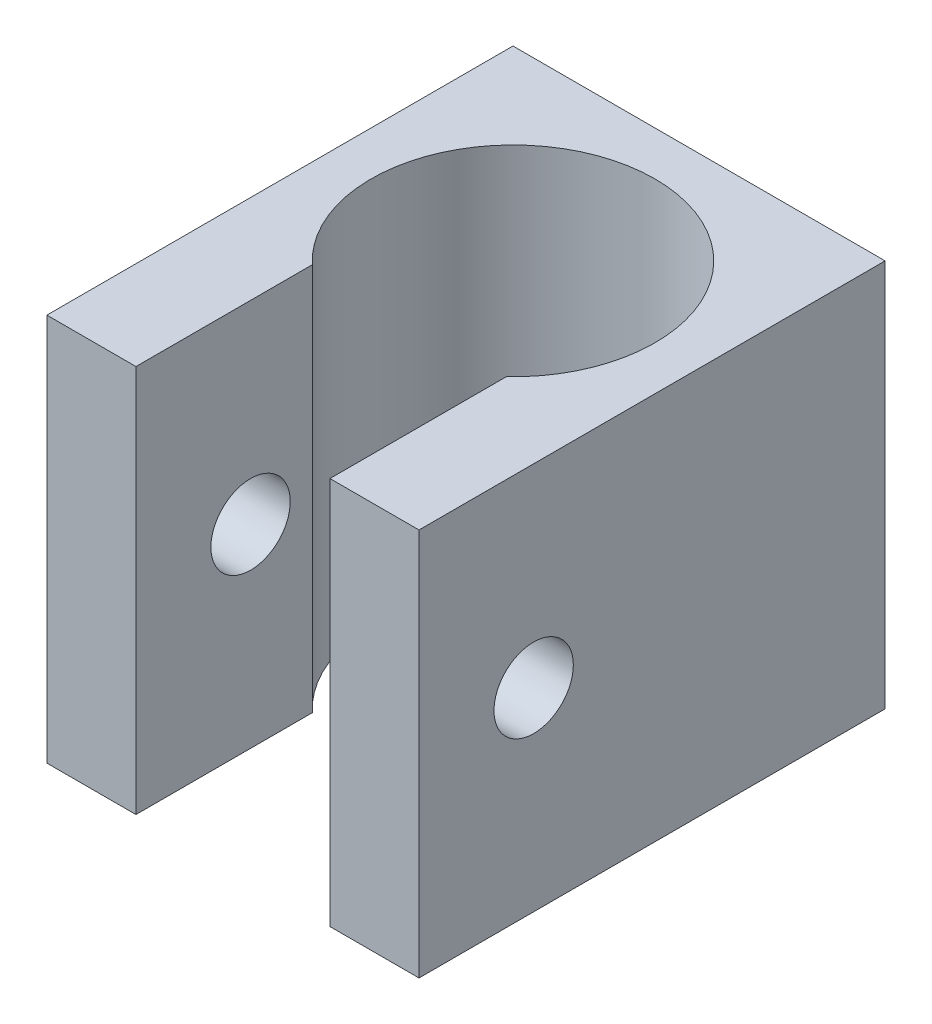
ISO-10303-21;
HEADER;
FILE_DESCRIPTION(('STEP AP214'),'2;1');
FILE_NAME('part.step','',(''),(''),'','','');
FILE_SCHEMA(('AUTOMOTIVE_DESIGN { 1 0 10303 214 1 1 1 1 }'));
ENDSEC;
DATA;
#1=APPLICATION_CONTEXT('core data for automotive mechanical design processes');
#2=APPLICATION_PROTOCOL_DEFINITION('international standard','automotive_design',2000,#1);
#3=PRODUCT_CONTEXT('',#1,'mechanical');
#4=PRODUCT('Part','Part','',(#3));
#5=PRODUCT_RELATED_PRODUCT_CATEGORY('part','',(#4));
#6=PRODUCT_DEFINITION_FORMATION('','',#4);
#7=PRODUCT_DEFINITION_CONTEXT('part definition',#1,'design');
#8=PRODUCT_DEFINITION('design','',#6,#7);
#9=PRODUCT_DEFINITION_SHAPE('','',#8);
#10=(LENGTH_UNIT() NAMED_UNIT(*) SI_UNIT(.MILLI.,.METRE.));
#11=(NAMED_UNIT(*) PLANE_ANGLE_UNIT() SI_UNIT($,.RADIAN.));
#12=(NAMED_UNIT(*) SI_UNIT($,.STERADIAN.) SOLID_ANGLE_UNIT());
#13=UNCERTAINTY_MEASURE_WITH_UNIT(LENGTH_MEASURE(1.E-05),#10,'distance_accuracy_value','');
#14=(GEOMETRIC_REPRESENTATION_CONTEXT(3) GLOBAL_UNCERTAINTY_ASSIGNED_CONTEXT((#13)) GLOBAL_UNIT_ASSIGNED_CONTEXT((#10,
#11,#12)) REPRESENTATION_CONTEXT('',''));
#15=CARTESIAN_POINT('',(0.,0.,0.));
#16=DIRECTION('',(0.,0.,1.));
#17=DIRECTION('',(1.,0.,0.));
#18=AXIS2_PLACEMENT_3D('',#15,#16,#17);
#19=CARTESIAN_POINT('',(-5.49999999999999,11.,15.));
#20=DIRECTION('',(-1.,0.,0.));
#21=DIRECTION('',(0.,0.,1.));
#22=AXIS2_PLACEMENT_3D('',#19,#20,#21);
#23=PLANE('',#22);
#24=CARTESIAN_POINT('',(-5.49999999999999,0.,8.49999999999999));
#25=DIRECTION('',(-1.,0.,0.));
#26=DIRECTION('',(0.,0.,1.));
#27=AXIS2_PLACEMENT_3D('',#24,#25,#26);
#28=CIRCLE('',#27,2.25);
#29=CARTESIAN_POINT('',(-5.49999999999999,0.,10.75));
#30=VERTEX_POINT('',#29);
#31=EDGE_CURVE('E135',#30,#30,#28,.T.);
#32=ORIENTED_EDGE('',*,*,#31,.T.);
#33=EDGE_LOOP('',(#32));
#34=FACE_BOUND('',#33,.T.);
#35=DIRECTION('',(0.,0.,-1.));
#36=VECTOR('',#35,1.);
#37=CARTESIAN_POINT('',(-5.49999999999999,-11.,15.));
#38=LINE('',#37,#36);
#39=CARTESIAN_POINT('',(-5.49999999999999,-11.,15.));
#40=VERTEX_POINT('',#39);
#41=CARTESIAN_POINT('',(-5.49999999999999,-11.,5.));
#42=VERTEX_POINT('',#41);
#43=EDGE_CURVE('E131',#40,#42,#38,.T.);
#44=ORIENTED_EDGE('',*,*,#43,.T.);
#45=DIRECTION('',(0.,-1.,0.));
#46=VECTOR('',#45,1.);
#47=CARTESIAN_POINT('',(-5.49999999999999,11.,5.));
#48=LINE('',#47,#46);
#49=CARTESIAN_POINT('',(-5.49999999999999,11.,5.));
#50=VERTEX_POINT('',#49);
#51=EDGE_CURVE('E11',#50,#42,#48,.T.);
#52=ORIENTED_EDGE('',*,*,#51,.F.);
#53=DIRECTION('',(0.,0.,-1.));
#54=VECTOR('',#53,1.);
#55=CARTESIAN_POINT('',(-5.49999999999999,11.,15.));
#56=LINE('',#55,#54);
#57=CARTESIAN_POINT('',(-5.49999999999999,11.,15.));
#58=VERTEX_POINT('',#57);
#59=EDGE_CURVE('E146',#58,#50,#56,.T.);
#60=ORIENTED_EDGE('',*,*,#59,.F.);
#61=DIRECTION('',(0.,-1.,0.));
#62=VECTOR('',#61,1.);
#63=CARTESIAN_POINT('',(-5.49999999999999,11.,15.));
#64=LINE('',#63,#62);
#65=EDGE_CURVE('E127',#58,#40,#64,.T.);
#66=ORIENTED_EDGE('',*,*,#65,.T.);
#67=EDGE_LOOP('',(#44,#52,#60,#66));
#68=FACE_BOUND('',#67,.T.);
#69=ADVANCED_FACE('F35',(#34,#68),#23,.F.);
#70=CARTESIAN_POINT('',(0.,11.,-0.878137460114387));
#71=DIRECTION('',(0.,-1.,0.));
#72=DIRECTION('',(0.,0.,-1.));
#73=AXIS2_PLACEMENT_3D('',#70,#71,#72);
#74=CYLINDRICAL_SURFACE('',#73,8.05);
#75=CARTESIAN_POINT('',(0.,-11.,-0.878137460114387));
#76=DIRECTION('',(0.,-1.,0.));
#77=DIRECTION('',(0.,0.,-1.));
#78=AXIS2_PLACEMENT_3D('',#75,#76,#77);
#79=CIRCLE('',#78,8.05);
#80=CARTESIAN_POINT('',(5.50000000000001,-11.,5.));
#81=VERTEX_POINT('',#80);
#82=EDGE_CURVE('E134',#42,#81,#79,.T.);
#83=ORIENTED_EDGE('',*,*,#82,.T.);
#84=DIRECTION('',(0.,-1.,0.));
#85=VECTOR('',#84,1.);
#86=CARTESIAN_POINT('',(5.50000000000001,11.,5.));
#87=LINE('',#86,#85);
#88=CARTESIAN_POINT('',(5.50000000000001,11.,5.));
#89=VERTEX_POINT('',#88);
#90=EDGE_CURVE('E43',#89,#81,#87,.T.);
#91=ORIENTED_EDGE('',*,*,#90,.F.);
#92=CARTESIAN_POINT('',(0.,11.,-0.878137460114387));
#93=DIRECTION('',(0.,-1.,0.));
#94=DIRECTION('',(0.,0.,-1.));
#95=AXIS2_PLACEMENT_3D('',#92,#93,#94);
#96=CIRCLE('',#95,8.05);
#97=EDGE_CURVE('E94',#50,#89,#96,.T.);
#98=ORIENTED_EDGE('',*,*,#97,.F.);
#99=ORIENTED_EDGE('',*,*,#51,.T.);
#100=EDGE_LOOP('',(#83,#91,#98,#99));
#101=FACE_BOUND('',#100,.T.);
#102=ADVANCED_FACE('F203',(#101),#74,.F.);
#103=CARTESIAN_POINT('',(5.50000000000001,11.,15.));
#104=DIRECTION('',(1.,0.,0.));
#105=DIRECTION('',(0.,0.,-1.));
#106=AXIS2_PLACEMENT_3D('',#103,#104,#105);
#107=PLANE('',#106);
#108=CARTESIAN_POINT('',(5.50000000000001,0.,8.49999999999999));
#109=DIRECTION('',(1.,0.,0.));
#110=DIRECTION('',(0.,0.,-1.));
#111=AXIS2_PLACEMENT_3D('',#108,#109,#110);
#112=CIRCLE('',#111,2.25);
#113=CARTESIAN_POINT('',(5.50000000000001,0.,6.24999999999999));
#114=VERTEX_POINT('',#113);
#115=EDGE_CURVE('E181',#114,#114,#112,.T.);
#116=ORIENTED_EDGE('',*,*,#115,.T.);
#117=EDGE_LOOP('',(#116));
#118=FACE_BOUND('',#117,.T.);
#119=DIRECTION('',(0.,0.,1.));
#120=VECTOR('',#119,1.);
#121=CARTESIAN_POINT('',(5.50000000000001,-11.,15.));
#122=LINE('',#121,#120);
#123=CARTESIAN_POINT('',(5.50000000000001,-11.,15.));
#124=VERTEX_POINT('',#123);
#125=EDGE_CURVE('E137',#81,#124,#122,.T.);
#126=ORIENTED_EDGE('',*,*,#125,.T.);
#127=DIRECTION('',(0.,-1.,0.));
#128=VECTOR('',#127,1.);
#129=CARTESIAN_POINT('',(5.50000000000001,11.,15.));
#130=LINE('',#129,#128);
#131=CARTESIAN_POINT('',(5.50000000000001,11.,15.));
#132=VERTEX_POINT('',#131);
#133=EDGE_CURVE('E153',#132,#124,#130,.T.);
#134=ORIENTED_EDGE('',*,*,#133,.F.);
#135=DIRECTION('',(0.,0.,1.));
#136=VECTOR('',#135,1.);
#137=CARTESIAN_POINT('',(5.50000000000001,11.,15.));
#138=LINE('',#137,#136);
#139=EDGE_CURVE('E161',#89,#132,#138,.T.);
#140=ORIENTED_EDGE('',*,*,#139,.F.);
#141=ORIENTED_EDGE('',*,*,#90,.T.);
#142=EDGE_LOOP('',(#126,#134,#140,#141));
#143=FACE_BOUND('',#142,.T.);
#144=ADVANCED_FACE('F159',(#118,#143),#107,.F.);
#145=CARTESIAN_POINT('',(10.55,11.,15.));
#146=DIRECTION('',(0.,0.,-1.));
#147=DIRECTION('',(-1.,0.,0.));
#148=AXIS2_PLACEMENT_3D('',#145,#146,#147);
#149=PLANE('',#148);
#150=DIRECTION('',(1.,0.,0.));
#151=VECTOR('',#150,1.);
#152=CARTESIAN_POINT('',(10.55,-11.,15.));
#153=LINE('',#152,#151);
#154=CARTESIAN_POINT('',(10.55,-11.,15.));
#155=VERTEX_POINT('',#154);
#156=EDGE_CURVE('E139',#124,#155,#153,.T.);
#157=ORIENTED_EDGE('',*,*,#156,.T.);
#158=DIRECTION('',(0.,-1.,0.));
#159=VECTOR('',#158,1.);
#160=CARTESIAN_POINT('',(10.55,11.,15.));
#161=LINE('',#160,#159);
#162=CARTESIAN_POINT('',(10.55,11.,15.));
#163=VERTEX_POINT('',#162);
#164=EDGE_CURVE('E150',#163,#155,#161,.T.);
#165=ORIENTED_EDGE('',*,*,#164,.F.);
#166=DIRECTION('',(1.,0.,0.));
#167=VECTOR('',#166,1.);
#168=CARTESIAN_POINT('',(10.55,11.,15.));
#169=LINE('',#168,#167);
#170=EDGE_CURVE('E173',#132,#163,#169,.T.);
#171=ORIENTED_EDGE('',*,*,#170,.F.);
#172=ORIENTED_EDGE('',*,*,#133,.T.);
#173=EDGE_LOOP('',(#157,#165,#171,#172));
#174=FACE_BOUND('',#173,.T.);
#175=ADVANCED_FACE('F169',(#174),#149,.F.);
#176=CARTESIAN_POINT('',(10.55,11.,-11.4281374601144));
#177=DIRECTION('',(-1.,0.,0.));
#178=DIRECTION('',(0.,0.,1.));
#179=AXIS2_PLACEMENT_3D('',#176,#177,#178);
#180=PLANE('',#179);
#181=CARTESIAN_POINT('',(10.55,0.,8.49999999999999));
#182=DIRECTION('',(1.,0.,0.));
#183=DIRECTION('',(0.,0.,-1.));
#184=AXIS2_PLACEMENT_3D('',#181,#182,#183);
#185=CIRCLE('',#184,2.25);
#186=CARTESIAN_POINT('',(10.55,0.,6.24999999999999));
#187=VERTEX_POINT('',#186);
#188=EDGE_CURVE('E187',#187,#187,#185,.T.);
#189=ORIENTED_EDGE('',*,*,#188,.F.);
#190=EDGE_LOOP('',(#189));
#191=FACE_BOUND('',#190,.T.);
#192=DIRECTION('',(0.,0.,-1.));
#193=VECTOR('',#192,1.);
#194=CARTESIAN_POINT('',(10.55,-11.,-11.4281374601144));
#195=LINE('',#194,#193);
#196=CARTESIAN_POINT('',(10.55,-11.,-11.4281374601144));
#197=VERTEX_POINT('',#196);
#198=EDGE_CURVE('E141',#155,#197,#195,.T.);
#199=ORIENTED_EDGE('',*,*,#198,.T.);
#200=DIRECTION('',(0.,-1.,0.));
#201=VECTOR('',#200,1.);
#202=CARTESIAN_POINT('',(10.55,11.,-11.4281374601144));
#203=LINE('',#202,#201);
#204=CARTESIAN_POINT('',(10.55,11.,-11.4281374601144));
#205=VERTEX_POINT('',#204);
#206=EDGE_CURVE('E122',#205,#197,#203,.T.);
#207=ORIENTED_EDGE('',*,*,#206,.F.);
#208=DIRECTION('',(0.,0.,-1.));
#209=VECTOR('',#208,1.);
#210=CARTESIAN_POINT('',(10.55,11.,-11.4281374601144));
#211=LINE('',#210,#209);
#212=EDGE_CURVE('E113',#163,#205,#211,.T.);
#213=ORIENTED_EDGE('',*,*,#212,.F.);
#214=ORIENTED_EDGE('',*,*,#164,.T.);
#215=EDGE_LOOP('',(#199,#207,#213,#214));
#216=FACE_BOUND('',#215,.T.);
#217=ADVANCED_FACE('F172',(#191,#216),#180,.F.);
#218=CARTESIAN_POINT('',(-10.55,11.,-11.4281374601144));
#219=DIRECTION('',(0.,0.,1.));
#220=DIRECTION('',(1.,0.,0.));
#221=AXIS2_PLACEMENT_3D('',#218,#219,#220);
#222=PLANE('',#221);
#223=DIRECTION('',(-1.,0.,0.));
#224=VECTOR('',#223,1.);
#225=CARTESIAN_POINT('',(-10.55,-11.,-11.4281374601144));
#226=LINE('',#225,#224);
#227=CARTESIAN_POINT('',(-10.55,-11.,-11.4281374601144));
#228=VERTEX_POINT('',#227);
#229=EDGE_CURVE('E121',#197,#228,#226,.T.);
#230=ORIENTED_EDGE('',*,*,#229,.T.);
#231=DIRECTION('',(0.,-1.,0.));
#232=VECTOR('',#231,1.);
#233=CARTESIAN_POINT('',(-10.55,11.,-11.4281374601144));
#234=LINE('',#233,#232);
#235=CARTESIAN_POINT('',(-10.55,11.,-11.4281374601144));
#236=VERTEX_POINT('',#235);
#237=EDGE_CURVE('E118',#236,#228,#234,.T.);
#238=ORIENTED_EDGE('',*,*,#237,.F.);
#239=DIRECTION('',(-1.,0.,0.));
#240=VECTOR('',#239,1.);
#241=CARTESIAN_POINT('',(-10.55,11.,-11.4281374601144));
#242=LINE('',#241,#240);
#243=EDGE_CURVE('E107',#205,#236,#242,.T.);
#244=ORIENTED_EDGE('',*,*,#243,.F.);
#245=ORIENTED_EDGE('',*,*,#206,.T.);
#246=EDGE_LOOP('',(#230,#238,#244,#245));
#247=FACE_BOUND('',#246,.T.);
#248=ADVANCED_FACE('F119',(#247),#222,.F.);
#249=CARTESIAN_POINT('',(-10.55,11.,15.));
#250=DIRECTION('',(1.,0.,0.));
#251=DIRECTION('',(0.,0.,-1.));
#252=AXIS2_PLACEMENT_3D('',#249,#250,#251);
#253=PLANE('',#252);
#254=CARTESIAN_POINT('',(-10.55,0.,8.49999999999999));
#255=DIRECTION('',(1.,0.,0.));
#256=DIRECTION('',(0.,0.,-1.));
#257=AXIS2_PLACEMENT_3D('',#254,#255,#256);
#258=CIRCLE('',#257,2.25);
#259=CARTESIAN_POINT('',(-10.55,0.,6.24999999999999));
#260=VERTEX_POINT('',#259);
#261=EDGE_CURVE('E184',#260,#260,#258,.F.);
#262=ORIENTED_EDGE('',*,*,#261,.F.);
#263=EDGE_LOOP('',(#262));
#264=FACE_BOUND('',#263,.T.);
#265=DIRECTION('',(0.,0.,1.));
#266=VECTOR('',#265,1.);
#267=CARTESIAN_POINT('',(-10.55,-11.,15.));
#268=LINE('',#267,#266);
#269=CARTESIAN_POINT('',(-10.55,-11.,15.));
#270=VERTEX_POINT('',#269);
#271=EDGE_CURVE('E80',#228,#270,#268,.T.);
#272=ORIENTED_EDGE('',*,*,#271,.T.);
#273=DIRECTION('',(0.,-1.,0.));
#274=VECTOR('',#273,1.);
#275=CARTESIAN_POINT('',(-10.55,11.,15.));
#276=LINE('',#275,#274);
#277=CARTESIAN_POINT('',(-10.55,11.,15.));
#278=VERTEX_POINT('',#277);
#279=EDGE_CURVE('E123',#278,#270,#276,.T.);
#280=ORIENTED_EDGE('',*,*,#279,.F.);
#281=DIRECTION('',(0.,0.,1.));
#282=VECTOR('',#281,1.);
#283=CARTESIAN_POINT('',(-10.55,11.,15.));
#284=LINE('',#283,#282);
#285=EDGE_CURVE('E111',#236,#278,#284,.T.);
#286=ORIENTED_EDGE('',*,*,#285,.F.);
#287=ORIENTED_EDGE('',*,*,#237,.T.);
#288=EDGE_LOOP('',(#272,#280,#286,#287));
#289=FACE_BOUND('',#288,.T.);
#290=ADVANCED_FACE('F125',(#264,#289),#253,.F.);
#291=CARTESIAN_POINT('',(-5.49999999999999,11.,15.));
#292=DIRECTION('',(0.,0.,-1.));
#293=DIRECTION('',(-1.,0.,0.));
#294=AXIS2_PLACEMENT_3D('',#291,#292,#293);
#295=PLANE('',#294);
#296=DIRECTION('',(1.,0.,0.));
#297=VECTOR('',#296,1.);
#298=CARTESIAN_POINT('',(-5.49999999999999,-11.,15.));
#299=LINE('',#298,#297);
#300=EDGE_CURVE('E86',#270,#40,#299,.T.);
#301=ORIENTED_EDGE('',*,*,#300,.T.);
#302=ORIENTED_EDGE('',*,*,#65,.F.);
#303=DIRECTION('',(1.,0.,0.));
#304=VECTOR('',#303,1.);
#305=CARTESIAN_POINT('',(-5.49999999999999,11.,15.));
#306=LINE('',#305,#304);
#307=EDGE_CURVE('E51',#278,#58,#306,.T.);
#308=ORIENTED_EDGE('',*,*,#307,.F.);
#309=ORIENTED_EDGE('',*,*,#279,.T.);
#310=EDGE_LOOP('',(#301,#302,#308,#309));
#311=FACE_BOUND('',#310,.T.);
#312=ADVANCED_FACE('F212',(#311),#295,.F.);
#313=CARTESIAN_POINT('',(0.,11.,-0.878137460114387));
#314=DIRECTION('',(0.,-1.,0.));
#315=DIRECTION('',(0.,0.,-1.));
#316=AXIS2_PLACEMENT_3D('',#313,#314,#315);
#317=PLANE('',#316);
#318=ORIENTED_EDGE('',*,*,#59,.T.);
#319=ORIENTED_EDGE('',*,*,#97,.T.);
#320=ORIENTED_EDGE('',*,*,#139,.T.);
#321=ORIENTED_EDGE('',*,*,#170,.T.);
#322=ORIENTED_EDGE('',*,*,#212,.T.);
#323=ORIENTED_EDGE('',*,*,#243,.T.);
#324=ORIENTED_EDGE('',*,*,#285,.T.);
#325=ORIENTED_EDGE('',*,*,#307,.T.);
#326=EDGE_LOOP('',(#318,#319,#320,#321,#322,#323,#324,#325));
#327=FACE_BOUND('',#326,.T.);
#328=ADVANCED_FACE('F109',(#327),#317,.F.);
#329=CARTESIAN_POINT('',(0.,-11.,-0.878137460114387));
#330=DIRECTION('',(0.,-1.,0.));
#331=DIRECTION('',(0.,0.,-1.));
#332=AXIS2_PLACEMENT_3D('',#329,#330,#331);
#333=PLANE('',#332);
#334=ORIENTED_EDGE('',*,*,#43,.F.);
#335=ORIENTED_EDGE('',*,*,#300,.F.);
#336=ORIENTED_EDGE('',*,*,#271,.F.);
#337=ORIENTED_EDGE('',*,*,#229,.F.);
#338=ORIENTED_EDGE('',*,*,#198,.F.);
#339=ORIENTED_EDGE('',*,*,#156,.F.);
#340=ORIENTED_EDGE('',*,*,#125,.F.);
#341=ORIENTED_EDGE('',*,*,#82,.F.);
#342=EDGE_LOOP('',(#334,#335,#336,#337,#338,#339,#340,#341));
#343=FACE_BOUND('',#342,.T.);
#344=ADVANCED_FACE('F165',(#343),#333,.T.);
#345=CARTESIAN_POINT('',(-16.9139610306789,0.,8.49999999999999));
#346=DIRECTION('',(1.,0.,0.));
#347=DIRECTION('',(0.,0.,-1.));
#348=AXIS2_PLACEMENT_3D('',#345,#346,#347);
#349=CYLINDRICAL_SURFACE('',#348,2.25);
#350=ORIENTED_EDGE('',*,*,#261,.T.);
#351=EDGE_LOOP('',(#350));
#352=FACE_BOUND('',#351,.T.);
#353=ORIENTED_EDGE('',*,*,#31,.F.);
#354=EDGE_LOOP('',(#353));
#355=FACE_BOUND('',#354,.T.);
#356=ADVANCED_FACE('F224',(#352,#355),#349,.F.);
#357=ORIENTED_EDGE('',*,*,#188,.T.);
#358=EDGE_LOOP('',(#357));
#359=FACE_BOUND('',#358,.T.);
#360=ORIENTED_EDGE('',*,*,#115,.F.);
#361=EDGE_LOOP('',(#360));
#362=FACE_BOUND('',#361,.T.);
#363=ADVANCED_FACE('F191',(#359,#362),#349,.F.);
#364=CLOSED_SHELL('',(#69,#102,#144,#175,#217,#248,#290,#312,#328,#344,#356,#363));
#365=MANIFOLD_SOLID_BREP('B2',#364);
#366=ADVANCED_BREP_SHAPE_REPRESENTATION('',(#18,#365),#14);
#367=SHAPE_DEFINITION_REPRESENTATION(#9,#366);
ENDSEC;
END-ISO-10303-21;
